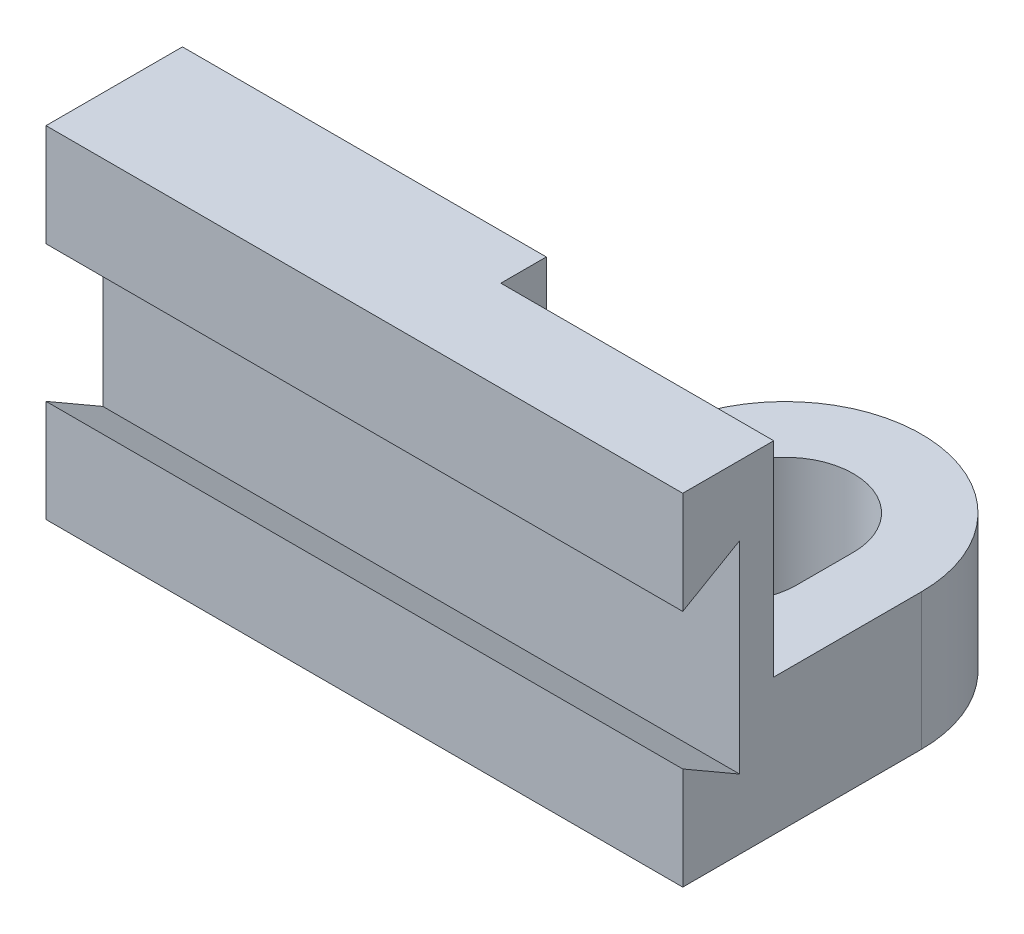
ISO-10303-21;
HEADER;
FILE_DESCRIPTION(('STEP AP214'),'2;1');
FILE_NAME('part.step','',(''),(''),'','','');
FILE_SCHEMA(('AUTOMOTIVE_DESIGN { 1 0 10303 214 1 1 1 1 }'));
ENDSEC;
DATA;
#1=APPLICATION_CONTEXT('core data for automotive mechanical design processes');
#2=APPLICATION_PROTOCOL_DEFINITION('international standard','automotive_design',2000,#1);
#3=PRODUCT_CONTEXT('',#1,'mechanical');
#4=PRODUCT('Part','Part','',(#3));
#5=PRODUCT_RELATED_PRODUCT_CATEGORY('part','',(#4));
#6=PRODUCT_DEFINITION_FORMATION('','',#4);
#7=PRODUCT_DEFINITION_CONTEXT('part definition',#1,'design');
#8=PRODUCT_DEFINITION('design','',#6,#7);
#9=PRODUCT_DEFINITION_SHAPE('','',#8);
#10=(LENGTH_UNIT() NAMED_UNIT(*) SI_UNIT(.MILLI.,.METRE.));
#11=(NAMED_UNIT(*) PLANE_ANGLE_UNIT() SI_UNIT($,.RADIAN.));
#12=(NAMED_UNIT(*) SI_UNIT($,.STERADIAN.) SOLID_ANGLE_UNIT());
#13=UNCERTAINTY_MEASURE_WITH_UNIT(LENGTH_MEASURE(1.E-05),#10,'distance_accuracy_value','');
#14=(GEOMETRIC_REPRESENTATION_CONTEXT(3) GLOBAL_UNCERTAINTY_ASSIGNED_CONTEXT((#13)) GLOBAL_UNIT_ASSIGNED_CONTEXT((#10,
#11,#12)) REPRESENTATION_CONTEXT('',''));
#15=CARTESIAN_POINT('',(0.,0.,0.));
#16=DIRECTION('',(0.,0.,1.));
#17=DIRECTION('',(1.,0.,0.));
#18=AXIS2_PLACEMENT_3D('',#15,#16,#17);
#19=CARTESIAN_POINT('',(0.,8.,0.));
#20=DIRECTION('',(0.,-1.,0.));
#21=DIRECTION('',(0.,0.,-1.));
#22=AXIS2_PLACEMENT_3D('',#19,#20,#21);
#23=PLANE('',#22);
#24=CARTESIAN_POINT('',(44.,8.,-21.));
#25=DIRECTION('',(0.,-1.,0.));
#26=DIRECTION('',(0.,0.,-1.));
#27=AXIS2_PLACEMENT_3D('',#24,#25,#26);
#28=CIRCLE('',#27,12.);
#29=CARTESIAN_POINT('',(40.466636051299,8.,-32.4680137428423));
#30=VERTEX_POINT('',#29);
#31=CARTESIAN_POINT('',(32.,8.,-21.));
#32=VERTEX_POINT('',#31);
#33=EDGE_CURVE('E12',#30,#32,#28,.F.);
#34=ORIENTED_EDGE('',*,*,#33,.F.);
#35=DIRECTION('',(0.955667811903527,0.,-0.29444699572508));
#36=VECTOR('',#35,1.);
#37=CARTESIAN_POINT('',(-5.62787032252309,8.,-18.2660193341695));
#38=LINE('',#37,#36);
#39=CARTESIAN_POINT('',(0.,8.,-20.));
#40=VERTEX_POINT('',#39);
#41=EDGE_CURVE('E226',#40,#30,#38,.T.);
#42=ORIENTED_EDGE('',*,*,#41,.F.);
#43=DIRECTION('',(0.,0.,-1.));
#44=VECTOR('',#43,1.);
#45=CARTESIAN_POINT('',(0.,8.,0.));
#46=LINE('',#45,#44);
#47=CARTESIAN_POINT('',(0.,8.,-12.));
#48=VERTEX_POINT('',#47);
#49=EDGE_CURVE('E223',#48,#40,#46,.T.);
#50=ORIENTED_EDGE('',*,*,#49,.F.);
#51=DIRECTION('',(1.,0.,0.));
#52=VECTOR('',#51,1.);
#53=CARTESIAN_POINT('',(0.,8.,-12.));
#54=LINE('',#53,#52);
#55=CARTESIAN_POINT('',(32.,8.,-12.));
#56=VERTEX_POINT('',#55);
#57=EDGE_CURVE('E230',#48,#56,#54,.T.);
#58=ORIENTED_EDGE('',*,*,#57,.T.);
#59=DIRECTION('',(0.,0.,1.));
#60=VECTOR('',#59,1.);
#61=CARTESIAN_POINT('',(32.,8.,-21.));
#62=LINE('',#61,#60);
#63=EDGE_CURVE('E203',#32,#56,#62,.T.);
#64=ORIENTED_EDGE('',*,*,#63,.F.);
#65=EDGE_LOOP('',(#34,#42,#50,#58,#64));
#66=FACE_BOUND('',#65,.T.);
#67=ADVANCED_FACE('F44',(#66),#23,.F.);
#68=CARTESIAN_POINT('',(32.,30.,-8.));
#69=DIRECTION('',(0.,0.,1.));
#70=DIRECTION('',(1.,0.,0.));
#71=AXIS2_PLACEMENT_3D('',#68,#69,#70);
#72=PLANE('',#71);
#73=DIRECTION('',(0.,-1.,0.));
#74=VECTOR('',#73,1.);
#75=CARTESIAN_POINT('',(56.,30.,-8.));
#76=LINE('',#75,#74);
#77=CARTESIAN_POINT('',(56.,30.,-8.));
#78=VERTEX_POINT('',#77);
#79=CARTESIAN_POINT('',(56.,12.,-8.));
#80=VERTEX_POINT('',#79);
#81=EDGE_CURVE('E313',#78,#80,#76,.T.);
#82=ORIENTED_EDGE('',*,*,#81,.T.);
#83=DIRECTION('',(1.,0.,0.));
#84=VECTOR('',#83,1.);
#85=CARTESIAN_POINT('',(32.,12.,-8.));
#86=LINE('',#85,#84);
#87=CARTESIAN_POINT('',(32.,12.,-8.));
#88=VERTEX_POINT('',#87);
#89=EDGE_CURVE('E59',#88,#80,#86,.T.);
#90=ORIENTED_EDGE('',*,*,#89,.F.);
#91=DIRECTION('',(0.,-1.,0.));
#92=VECTOR('',#91,1.);
#93=CARTESIAN_POINT('',(32.,30.,-8.));
#94=LINE('',#93,#92);
#95=CARTESIAN_POINT('',(32.,30.,-8.));
#96=VERTEX_POINT('',#95);
#97=EDGE_CURVE('E311',#96,#88,#94,.T.);
#98=ORIENTED_EDGE('',*,*,#97,.F.);
#99=DIRECTION('',(-1.,0.,0.));
#100=VECTOR('',#99,1.);
#101=CARTESIAN_POINT('',(32.,30.,-8.));
#102=LINE('',#101,#100);
#103=EDGE_CURVE('E294',#78,#96,#102,.T.);
#104=ORIENTED_EDGE('',*,*,#103,.F.);
#105=EDGE_LOOP('',(#82,#90,#98,#104));
#106=FACE_BOUND('',#105,.T.);
#107=ADVANCED_FACE('F358',(#106),#72,.F.);
#108=CARTESIAN_POINT('',(32.,30.,-12.));
#109=DIRECTION('',(-1.,0.,0.));
#110=DIRECTION('',(0.,0.,1.));
#111=AXIS2_PLACEMENT_3D('',#108,#109,#110);
#112=PLANE('',#111);
#113=ORIENTED_EDGE('',*,*,#97,.T.);
#114=DIRECTION('',(0.,0.,1.));
#115=VECTOR('',#114,1.);
#116=CARTESIAN_POINT('',(32.,12.,-21.));
#117=LINE('',#116,#115);
#118=CARTESIAN_POINT('',(32.,12.,-12.));
#119=VERTEX_POINT('',#118);
#120=EDGE_CURVE('E66',#119,#88,#117,.T.);
#121=ORIENTED_EDGE('',*,*,#120,.F.);
#122=DIRECTION('',(0.,-1.,0.));
#123=VECTOR('',#122,1.);
#124=CARTESIAN_POINT('',(32.,30.,-12.));
#125=LINE('',#124,#123);
#126=CARTESIAN_POINT('',(32.,30.,-12.));
#127=VERTEX_POINT('',#126);
#128=EDGE_CURVE('E309',#127,#119,#125,.T.);
#129=ORIENTED_EDGE('',*,*,#128,.F.);
#130=DIRECTION('',(0.,0.,-1.));
#131=VECTOR('',#130,1.);
#132=CARTESIAN_POINT('',(32.,30.,-12.));
#133=LINE('',#132,#131);
#134=EDGE_CURVE('E296',#96,#127,#133,.T.);
#135=ORIENTED_EDGE('',*,*,#134,.F.);
#136=EDGE_LOOP('',(#113,#121,#129,#135));
#137=FACE_BOUND('',#136,.T.);
#138=ADVANCED_FACE('F364',(#137),#112,.F.);
#139=CARTESIAN_POINT('',(0.,30.,-12.));
#140=DIRECTION('',(0.,0.,1.));
#141=DIRECTION('',(1.,0.,0.));
#142=AXIS2_PLACEMENT_3D('',#139,#140,#141);
#143=PLANE('',#142);
#144=ORIENTED_EDGE('',*,*,#57,.F.);
#145=DIRECTION('',(0.,-1.,0.));
#146=VECTOR('',#145,1.);
#147=CARTESIAN_POINT('',(0.,30.,-12.));
#148=LINE('',#147,#146);
#149=CARTESIAN_POINT('',(0.,30.,-12.));
#150=VERTEX_POINT('',#149);
#151=EDGE_CURVE('E300',#150,#48,#148,.T.);
#152=ORIENTED_EDGE('',*,*,#151,.F.);
#153=DIRECTION('',(-1.,0.,0.));
#154=VECTOR('',#153,1.);
#155=CARTESIAN_POINT('',(0.,30.,-12.));
#156=LINE('',#155,#154);
#157=EDGE_CURVE('E298',#127,#150,#156,.T.);
#158=ORIENTED_EDGE('',*,*,#157,.F.);
#159=ORIENTED_EDGE('',*,*,#128,.T.);
#160=DIRECTION('',(0.,1.,0.));
#161=VECTOR('',#160,1.);
#162=CARTESIAN_POINT('',(32.,30.,-12.));
#163=LINE('',#162,#161);
#164=EDGE_CURVE('E219',#56,#119,#163,.T.);
#165=ORIENTED_EDGE('',*,*,#164,.F.);
#166=EDGE_LOOP('',(#144,#152,#158,#159,#165));
#167=FACE_BOUND('',#166,.T.);
#168=ADVANCED_FACE('F353',(#167),#143,.F.);
#169=CARTESIAN_POINT('',(0.,30.,0.));
#170=DIRECTION('',(0.,0.,-1.));
#171=DIRECTION('',(-1.,0.,0.));
#172=AXIS2_PLACEMENT_3D('',#169,#170,#171);
#173=PLANE('',#172);
#174=DIRECTION('',(-1.,0.,0.));
#175=VECTOR('',#174,1.);
#176=CARTESIAN_POINT('',(56.,9.00074722567097,0.));
#177=LINE('',#176,#175);
#178=CARTESIAN_POINT('',(56.,9.00074722567097,0.));
#179=VERTEX_POINT('',#178);
#180=CARTESIAN_POINT('',(0.,9.00074722567097,0.));
#181=VERTEX_POINT('',#180);
#182=EDGE_CURVE('E273',#179,#181,#177,.T.);
#183=ORIENTED_EDGE('',*,*,#182,.T.);
#184=DIRECTION('',(0.,-1.,0.));
#185=VECTOR('',#184,1.);
#186=CARTESIAN_POINT('',(0.,30.,0.));
#187=LINE('',#186,#185);
#188=CARTESIAN_POINT('',(0.,0.,0.));
#189=VERTEX_POINT('',#188);
#190=EDGE_CURVE('E318',#181,#189,#187,.T.);
#191=ORIENTED_EDGE('',*,*,#190,.T.);
#192=DIRECTION('',(1.,0.,0.));
#193=VECTOR('',#192,1.);
#194=CARTESIAN_POINT('',(0.,0.,0.));
#195=LINE('',#194,#193);
#196=CARTESIAN_POINT('',(56.,0.,0.));
#197=VERTEX_POINT('',#196);
#198=EDGE_CURVE('E303',#189,#197,#195,.T.);
#199=ORIENTED_EDGE('',*,*,#198,.T.);
#200=DIRECTION('',(0.,-1.,0.));
#201=VECTOR('',#200,1.);
#202=CARTESIAN_POINT('',(56.,30.,0.));
#203=LINE('',#202,#201);
#204=EDGE_CURVE('E315',#179,#197,#203,.T.);
#205=ORIENTED_EDGE('',*,*,#204,.F.);
#206=EDGE_LOOP('',(#183,#191,#199,#205));
#207=FACE_BOUND('',#206,.T.);
#208=ADVANCED_FACE('F326',(#207),#173,.F.);
#209=CARTESIAN_POINT('',(0.,30.,-12.));
#210=DIRECTION('',(1.,0.,0.));
#211=DIRECTION('',(0.,0.,-1.));
#212=AXIS2_PLACEMENT_3D('',#209,#210,#211);
#213=PLANE('',#212);
#214=DIRECTION('',(0.,1.,0.));
#215=VECTOR('',#214,1.);
#216=CARTESIAN_POINT('',(0.,30.,-5.));
#217=LINE('',#216,#215);
#218=CARTESIAN_POINT('',(0.,6.11399587972281,-5.));
#219=VERTEX_POINT('',#218);
#220=CARTESIAN_POINT('',(0.,23.8867513459482,-5.));
#221=VERTEX_POINT('',#220);
#222=EDGE_CURVE('E282',#219,#221,#217,.T.);
#223=ORIENTED_EDGE('',*,*,#222,.T.);
#224=DIRECTION('',(0.,-0.500000000000004,0.866025403784436));
#225=VECTOR('',#224,1.);
#226=CARTESIAN_POINT('',(0.,28.4461524227067,-12.89711431703));
#227=LINE('',#226,#225);
#228=CARTESIAN_POINT('',(0.,21.,0.));
#229=VERTEX_POINT('',#228);
#230=EDGE_CURVE('E279',#221,#229,#227,.T.);
#231=ORIENTED_EDGE('',*,*,#230,.T.);
#232=CARTESIAN_POINT('',(0.,30.,0.));
#233=VERTEX_POINT('',#232);
#234=EDGE_CURVE('E52',#233,#229,#187,.T.);
#235=ORIENTED_EDGE('',*,*,#234,.F.);
#236=DIRECTION('',(0.,0.,1.));
#237=VECTOR('',#236,1.);
#238=CARTESIAN_POINT('',(0.,30.,-12.));
#239=LINE('',#238,#237);
#240=EDGE_CURVE('E286',#150,#233,#239,.T.);
#241=ORIENTED_EDGE('',*,*,#240,.F.);
#242=ORIENTED_EDGE('',*,*,#151,.T.);
#243=ORIENTED_EDGE('',*,*,#49,.T.);
#244=DIRECTION('',(0.,-1.,0.));
#245=VECTOR('',#244,1.);
#246=CARTESIAN_POINT('',(0.,8.,-20.));
#247=LINE('',#246,#245);
#248=CARTESIAN_POINT('',(0.,0.,-20.));
#249=VERTEX_POINT('',#248);
#250=EDGE_CURVE('E253',#40,#249,#247,.T.);
#251=ORIENTED_EDGE('',*,*,#250,.T.);
#252=DIRECTION('',(0.,0.,1.));
#253=VECTOR('',#252,1.);
#254=CARTESIAN_POINT('',(0.,0.,-12.));
#255=LINE('',#254,#253);
#256=EDGE_CURVE('E285',#249,#189,#255,.T.);
#257=ORIENTED_EDGE('',*,*,#256,.T.);
#258=ORIENTED_EDGE('',*,*,#190,.F.);
#259=DIRECTION('',(0.,0.500000000000005,0.866025403784436));
#260=VECTOR('',#259,1.);
#261=CARTESIAN_POINT('',(0.,9.05440799654666,0.0929431815300061));
#262=LINE('',#261,#260);
#263=EDGE_CURVE('E270',#219,#181,#262,.T.);
#264=ORIENTED_EDGE('',*,*,#263,.F.);
#265=EDGE_LOOP('',(#223,#231,#235,#241,#242,#243,#251,#257,#258,#264));
#266=FACE_BOUND('',#265,.T.);
#267=ADVANCED_FACE('F46',(#266),#213,.F.);
#268=ORIENTED_EDGE('',*,*,#234,.T.);
#269=DIRECTION('',(-1.,0.,0.));
#270=VECTOR('',#269,1.);
#271=CARTESIAN_POINT('',(56.,21.,0.));
#272=LINE('',#271,#270);
#273=CARTESIAN_POINT('',(56.,21.,0.));
#274=VERTEX_POINT('',#273);
#275=EDGE_CURVE('E271',#274,#229,#272,.T.);
#276=ORIENTED_EDGE('',*,*,#275,.F.);
#277=CARTESIAN_POINT('',(56.,30.,0.));
#278=VERTEX_POINT('',#277);
#279=EDGE_CURVE('E316',#278,#274,#203,.T.);
#280=ORIENTED_EDGE('',*,*,#279,.F.);
#281=DIRECTION('',(1.,0.,0.));
#282=VECTOR('',#281,1.);
#283=CARTESIAN_POINT('',(0.,30.,0.));
#284=LINE('',#283,#282);
#285=EDGE_CURVE('E289',#233,#278,#284,.T.);
#286=ORIENTED_EDGE('',*,*,#285,.F.);
#287=EDGE_LOOP('',(#268,#276,#280,#286));
#288=FACE_BOUND('',#287,.T.);
#289=ADVANCED_FACE('F407',(#288),#173,.F.);
#290=CARTESIAN_POINT('',(56.,30.,-8.));
#291=DIRECTION('',(-1.,0.,0.));
#292=DIRECTION('',(0.,0.,1.));
#293=AXIS2_PLACEMENT_3D('',#290,#291,#292);
#294=PLANE('',#293);
#295=ORIENTED_EDGE('',*,*,#279,.T.);
#296=DIRECTION('',(0.,0.500000000000004,-0.866025403784437));
#297=VECTOR('',#296,1.);
#298=CARTESIAN_POINT('',(56.,15.7499999999999,9.09326673973666));
#299=LINE('',#298,#297);
#300=CARTESIAN_POINT('',(56.,23.8867513459482,-4.99999999999999));
#301=VERTEX_POINT('',#300);
#302=EDGE_CURVE('E263',#274,#301,#299,.T.);
#303=ORIENTED_EDGE('',*,*,#302,.T.);
#304=DIRECTION('',(0.,-1.,0.));
#305=VECTOR('',#304,1.);
#306=CARTESIAN_POINT('',(56.,0.,-4.99999999999999));
#307=LINE('',#306,#305);
#308=CARTESIAN_POINT('',(56.,6.11399587972281,-4.99999999999999));
#309=VERTEX_POINT('',#308);
#310=EDGE_CURVE('E250',#301,#309,#307,.T.);
#311=ORIENTED_EDGE('',*,*,#310,.T.);
#312=DIRECTION('',(0.,-0.500000000000005,-0.866025403784436));
#313=VECTOR('',#312,1.);
#314=CARTESIAN_POINT('',(56.,6.75056041925319,-3.8974378752367));
#315=LINE('',#314,#313);
#316=EDGE_CURVE('E261',#179,#309,#315,.T.);
#317=ORIENTED_EDGE('',*,*,#316,.F.);
#318=ORIENTED_EDGE('',*,*,#204,.T.);
#319=DIRECTION('',(0.,0.,-1.));
#320=VECTOR('',#319,1.);
#321=CARTESIAN_POINT('',(56.,0.,-8.));
#322=LINE('',#321,#320);
#323=CARTESIAN_POINT('',(56.,0.,-21.));
#324=VERTEX_POINT('',#323);
#325=EDGE_CURVE('E290',#197,#324,#322,.T.);
#326=ORIENTED_EDGE('',*,*,#325,.T.);
#327=DIRECTION('',(0.,-1.,0.));
#328=VECTOR('',#327,1.);
#329=CARTESIAN_POINT('',(56.,8.,-21.));
#330=LINE('',#329,#328);
#331=CARTESIAN_POINT('',(56.,12.,-21.));
#332=VERTEX_POINT('',#331);
#333=EDGE_CURVE('E247',#332,#324,#330,.T.);
#334=ORIENTED_EDGE('',*,*,#333,.F.);
#335=DIRECTION('',(0.,0.,-1.));
#336=VECTOR('',#335,1.);
#337=CARTESIAN_POINT('',(56.,12.,-8.));
#338=LINE('',#337,#336);
#339=EDGE_CURVE('E211',#80,#332,#338,.T.);
#340=ORIENTED_EDGE('',*,*,#339,.F.);
#341=ORIENTED_EDGE('',*,*,#81,.F.);
#342=DIRECTION('',(0.,0.,-1.));
#343=VECTOR('',#342,1.);
#344=CARTESIAN_POINT('',(56.,30.,-8.));
#345=LINE('',#344,#343);
#346=EDGE_CURVE('E292',#278,#78,#345,.T.);
#347=ORIENTED_EDGE('',*,*,#346,.F.);
#348=EDGE_LOOP('',(#295,#303,#311,#317,#318,#326,#334,#340,#341,#347));
#349=FACE_BOUND('',#348,.T.);
#350=ADVANCED_FACE('F347',(#349),#294,.F.);
#351=CARTESIAN_POINT('',(0.,30.,0.));
#352=DIRECTION('',(0.,1.,0.));
#353=DIRECTION('',(0.,0.,1.));
#354=AXIS2_PLACEMENT_3D('',#351,#352,#353);
#355=PLANE('',#354);
#356=ORIENTED_EDGE('',*,*,#240,.T.);
#357=ORIENTED_EDGE('',*,*,#285,.T.);
#358=ORIENTED_EDGE('',*,*,#346,.T.);
#359=ORIENTED_EDGE('',*,*,#103,.T.);
#360=ORIENTED_EDGE('',*,*,#134,.T.);
#361=ORIENTED_EDGE('',*,*,#157,.T.);
#362=EDGE_LOOP('',(#356,#357,#358,#359,#360,#361));
#363=FACE_BOUND('',#362,.T.);
#364=ADVANCED_FACE('F397',(#363),#355,.T.);
#365=CARTESIAN_POINT('',(0.,0.,0.));
#366=DIRECTION('',(0.,1.,0.));
#367=DIRECTION('',(0.,0.,1.));
#368=AXIS2_PLACEMENT_3D('',#365,#366,#367);
#369=PLANE('',#368);
#370=ORIENTED_EDGE('',*,*,#256,.F.);
#371=DIRECTION('',(0.955667811903527,0.,-0.29444699572508));
#372=VECTOR('',#371,1.);
#373=CARTESIAN_POINT('',(-5.62787032252309,0.,-18.2660193341695));
#374=LINE('',#373,#372);
#375=CARTESIAN_POINT('',(40.466636051299,0.,-32.4680137428423));
#376=VERTEX_POINT('',#375);
#377=EDGE_CURVE('E242',#249,#376,#374,.T.);
#378=ORIENTED_EDGE('',*,*,#377,.T.);
#379=CARTESIAN_POINT('',(44.,0.,-21.));
#380=DIRECTION('',(0.,-1.,0.));
#381=DIRECTION('',(0.,0.,-1.));
#382=AXIS2_PLACEMENT_3D('',#379,#380,#381);
#383=CIRCLE('',#382,12.);
#384=EDGE_CURVE('E227',#324,#376,#383,.F.);
#385=ORIENTED_EDGE('',*,*,#384,.F.);
#386=ORIENTED_EDGE('',*,*,#325,.F.);
#387=ORIENTED_EDGE('',*,*,#198,.F.);
#388=EDGE_LOOP('',(#370,#378,#385,#386,#387));
#389=FACE_BOUND('',#388,.T.);
#390=CARTESIAN_POINT('',(44.,0.,-16.));
#391=DIRECTION('',(0.,-1.,0.));
#392=DIRECTION('',(0.,0.,-1.));
#393=AXIS2_PLACEMENT_3D('',#390,#391,#392);
#394=CIRCLE('',#393,6.);
#395=CARTESIAN_POINT('',(50.,0.,-16.));
#396=VERTEX_POINT('',#395);
#397=CARTESIAN_POINT('',(38.,0.,-16.));
#398=VERTEX_POINT('',#397);
#399=EDGE_CURVE('E222',#396,#398,#394,.T.);
#400=ORIENTED_EDGE('',*,*,#399,.F.);
#401=DIRECTION('',(0.,0.,-1.));
#402=VECTOR('',#401,1.);
#403=CARTESIAN_POINT('',(50.,0.,0.));
#404=LINE('',#403,#402);
#405=CARTESIAN_POINT('',(50.,0.,-21.));
#406=VERTEX_POINT('',#405);
#407=EDGE_CURVE('E236',#396,#406,#404,.T.);
#408=ORIENTED_EDGE('',*,*,#407,.T.);
#409=CARTESIAN_POINT('',(44.,0.,-21.));
#410=DIRECTION('',(0.,-1.,0.));
#411=DIRECTION('',(0.,0.,-1.));
#412=AXIS2_PLACEMENT_3D('',#409,#410,#411);
#413=CIRCLE('',#412,6.);
#414=CARTESIAN_POINT('',(38.,0.,-21.));
#415=VERTEX_POINT('',#414);
#416=EDGE_CURVE('E239',#415,#406,#413,.T.);
#417=ORIENTED_EDGE('',*,*,#416,.F.);
#418=DIRECTION('',(0.,0.,-1.));
#419=VECTOR('',#418,1.);
#420=CARTESIAN_POINT('',(38.,0.,0.));
#421=LINE('',#420,#419);
#422=EDGE_CURVE('E181',#398,#415,#421,.T.);
#423=ORIENTED_EDGE('',*,*,#422,.F.);
#424=EDGE_LOOP('',(#400,#408,#417,#423));
#425=FACE_BOUND('',#424,.T.);
#426=ADVANCED_FACE('F332',(#389,#425),#369,.F.);
#427=CARTESIAN_POINT('',(56.,0.,-4.99999999999999));
#428=DIRECTION('',(0.,0.,-1.));
#429=DIRECTION('',(-1.,0.,0.));
#430=AXIS2_PLACEMENT_3D('',#427,#428,#429);
#431=PLANE('',#430);
#432=DIRECTION('',(-1.,0.,0.));
#433=VECTOR('',#432,1.);
#434=CARTESIAN_POINT('',(56.,6.11399587972281,-4.99999999999999));
#435=LINE('',#434,#433);
#436=EDGE_CURVE('E266',#309,#219,#435,.T.);
#437=ORIENTED_EDGE('',*,*,#436,.F.);
#438=ORIENTED_EDGE('',*,*,#310,.F.);
#439=DIRECTION('',(-1.,0.,0.));
#440=VECTOR('',#439,1.);
#441=CARTESIAN_POINT('',(56.,23.8867513459482,-4.99999999999999));
#442=LINE('',#441,#440);
#443=EDGE_CURVE('E267',#301,#221,#442,.T.);
#444=ORIENTED_EDGE('',*,*,#443,.T.);
#445=ORIENTED_EDGE('',*,*,#222,.F.);
#446=EDGE_LOOP('',(#437,#438,#444,#445));
#447=FACE_BOUND('',#446,.T.);
#448=ADVANCED_FACE('F389',(#447),#431,.F.);
#449=CARTESIAN_POINT('',(56.,15.7499999999999,9.09326673973666));
#450=DIRECTION('',(0.,0.866025403784436,0.500000000000004));
#451=DIRECTION('',(0.,-0.500000000000004,0.866025403784436));
#452=AXIS2_PLACEMENT_3D('',#449,#450,#451);
#453=PLANE('',#452);
#454=ORIENTED_EDGE('',*,*,#443,.F.);
#455=ORIENTED_EDGE('',*,*,#302,.F.);
#456=ORIENTED_EDGE('',*,*,#275,.T.);
#457=ORIENTED_EDGE('',*,*,#230,.F.);
#458=EDGE_LOOP('',(#454,#455,#456,#457));
#459=FACE_BOUND('',#458,.T.);
#460=ADVANCED_FACE('F386',(#459),#453,.F.);
#461=CARTESIAN_POINT('',(56.,6.75056041925319,-3.8974378752367));
#462=DIRECTION('',(0.,0.866025403784436,-0.500000000000005));
#463=DIRECTION('',(0.,0.500000000000005,0.866025403784436));
#464=AXIS2_PLACEMENT_3D('',#461,#462,#463);
#465=PLANE('',#464);
#466=ORIENTED_EDGE('',*,*,#263,.T.);
#467=ORIENTED_EDGE('',*,*,#182,.F.);
#468=ORIENTED_EDGE('',*,*,#316,.T.);
#469=ORIENTED_EDGE('',*,*,#436,.T.);
#470=EDGE_LOOP('',(#466,#467,#468,#469));
#471=FACE_BOUND('',#470,.T.);
#472=ADVANCED_FACE('F372',(#471),#465,.T.);
#473=CARTESIAN_POINT('',(44.,8.,-21.));
#474=DIRECTION('',(0.,-1.,0.));
#475=DIRECTION('',(0.,0.,-1.));
#476=AXIS2_PLACEMENT_3D('',#473,#474,#475);
#477=CYLINDRICAL_SURFACE('',#476,12.);
#478=ORIENTED_EDGE('',*,*,#384,.T.);
#479=DIRECTION('',(0.,-1.,0.));
#480=VECTOR('',#479,1.);
#481=CARTESIAN_POINT('',(40.466636051299,8.,-32.4680137428423));
#482=LINE('',#481,#480);
#483=EDGE_CURVE('E251',#30,#376,#482,.T.);
#484=ORIENTED_EDGE('',*,*,#483,.F.);
#485=ORIENTED_EDGE('',*,*,#33,.T.);
#486=DIRECTION('',(0.,-1.,0.));
#487=VECTOR('',#486,1.);
#488=CARTESIAN_POINT('',(32.,12.,-21.));
#489=LINE('',#488,#487);
#490=CARTESIAN_POINT('',(32.,12.,-21.));
#491=VERTEX_POINT('',#490);
#492=EDGE_CURVE('E214',#491,#32,#489,.T.);
#493=ORIENTED_EDGE('',*,*,#492,.F.);
#494=CARTESIAN_POINT('',(44.,12.,-21.));
#495=DIRECTION('',(0.,1.,0.));
#496=DIRECTION('',(0.,0.,1.));
#497=AXIS2_PLACEMENT_3D('',#494,#495,#496);
#498=CIRCLE('',#497,12.);
#499=EDGE_CURVE('E204',#332,#491,#498,.T.);
#500=ORIENTED_EDGE('',*,*,#499,.F.);
#501=ORIENTED_EDGE('',*,*,#333,.T.);
#502=EDGE_LOOP('',(#478,#484,#485,#493,#500,#501));
#503=FACE_BOUND('',#502,.T.);
#504=ADVANCED_FACE('F343',(#503),#477,.T.);
#505=CARTESIAN_POINT('',(44.,8.,-16.));
#506=DIRECTION('',(0.,-1.,0.));
#507=DIRECTION('',(0.,0.,-1.));
#508=AXIS2_PLACEMENT_3D('',#505,#506,#507);
#509=CYLINDRICAL_SURFACE('',#508,6.);
#510=ORIENTED_EDGE('',*,*,#399,.T.);
#511=DIRECTION('',(0.,-1.,0.));
#512=VECTOR('',#511,1.);
#513=CARTESIAN_POINT('',(38.,8.,-16.));
#514=LINE('',#513,#512);
#515=CARTESIAN_POINT('',(38.,12.,-16.));
#516=VERTEX_POINT('',#515);
#517=EDGE_CURVE('E185',#516,#398,#514,.T.);
#518=ORIENTED_EDGE('',*,*,#517,.F.);
#519=CARTESIAN_POINT('',(44.,12.,-15.9999999999671));
#520=DIRECTION('',(0.,1.,0.));
#521=DIRECTION('',(0.,0.,1.));
#522=AXIS2_PLACEMENT_3D('',#519,#520,#521);
#523=CIRCLE('',#522,5.99999999999999);
#524=CARTESIAN_POINT('',(50.,12.,-15.9999999999671));
#525=VERTEX_POINT('',#524);
#526=EDGE_CURVE('E197',#516,#525,#523,.T.);
#527=ORIENTED_EDGE('',*,*,#526,.T.);
#528=DIRECTION('',(0.,-1.,0.));
#529=VECTOR('',#528,1.);
#530=CARTESIAN_POINT('',(50.,8.,-16.));
#531=LINE('',#530,#529);
#532=EDGE_CURVE('E233',#525,#396,#531,.T.);
#533=ORIENTED_EDGE('',*,*,#532,.T.);
#534=EDGE_LOOP('',(#510,#518,#527,#533));
#535=FACE_BOUND('',#534,.T.);
#536=ADVANCED_FACE('F371',(#535),#509,.F.);
#537=CARTESIAN_POINT('',(38.,8.,0.));
#538=DIRECTION('',(-1.,0.,0.));
#539=DIRECTION('',(0.,0.,1.));
#540=AXIS2_PLACEMENT_3D('',#537,#538,#539);
#541=PLANE('',#540);
#542=ORIENTED_EDGE('',*,*,#422,.T.);
#543=DIRECTION('',(0.,-1.,0.));
#544=VECTOR('',#543,1.);
#545=CARTESIAN_POINT('',(38.,8.,-21.));
#546=LINE('',#545,#544);
#547=CARTESIAN_POINT('',(38.,12.,-21.));
#548=VERTEX_POINT('',#547);
#549=EDGE_CURVE('E174',#548,#415,#546,.T.);
#550=ORIENTED_EDGE('',*,*,#549,.F.);
#551=DIRECTION('',(0.,0.,1.));
#552=VECTOR('',#551,1.);
#553=CARTESIAN_POINT('',(38.,12.,-21.));
#554=LINE('',#553,#552);
#555=EDGE_CURVE('E179',#548,#516,#554,.T.);
#556=ORIENTED_EDGE('',*,*,#555,.T.);
#557=ORIENTED_EDGE('',*,*,#517,.T.);
#558=EDGE_LOOP('',(#542,#550,#556,#557));
#559=FACE_BOUND('',#558,.T.);
#560=ADVANCED_FACE('F176',(#559),#541,.F.);
#561=CARTESIAN_POINT('',(44.,8.,-21.));
#562=DIRECTION('',(0.,-1.,0.));
#563=DIRECTION('',(0.,0.,-1.));
#564=AXIS2_PLACEMENT_3D('',#561,#562,#563);
#565=CYLINDRICAL_SURFACE('',#564,6.);
#566=ORIENTED_EDGE('',*,*,#416,.T.);
#567=DIRECTION('',(0.,-1.,0.));
#568=VECTOR('',#567,1.);
#569=CARTESIAN_POINT('',(50.,8.,-21.));
#570=LINE('',#569,#568);
#571=CARTESIAN_POINT('',(50.,12.,-21.));
#572=VERTEX_POINT('',#571);
#573=EDGE_CURVE('E186',#572,#406,#570,.T.);
#574=ORIENTED_EDGE('',*,*,#573,.F.);
#575=CARTESIAN_POINT('',(44.,12.,-21.));
#576=DIRECTION('',(0.,1.,0.));
#577=DIRECTION('',(0.,0.,-1.));
#578=AXIS2_PLACEMENT_3D('',#575,#576,#577);
#579=CIRCLE('',#578,6.);
#580=EDGE_CURVE('E189',#572,#548,#579,.T.);
#581=ORIENTED_EDGE('',*,*,#580,.T.);
#582=ORIENTED_EDGE('',*,*,#549,.T.);
#583=EDGE_LOOP('',(#566,#574,#581,#582));
#584=FACE_BOUND('',#583,.T.);
#585=ADVANCED_FACE('F190',(#584),#565,.F.);
#586=CARTESIAN_POINT('',(50.,8.,0.));
#587=DIRECTION('',(-1.,0.,0.));
#588=DIRECTION('',(0.,0.,1.));
#589=AXIS2_PLACEMENT_3D('',#586,#587,#588);
#590=PLANE('',#589);
#591=ORIENTED_EDGE('',*,*,#407,.F.);
#592=ORIENTED_EDGE('',*,*,#532,.F.);
#593=DIRECTION('',(0.,0.,-1.));
#594=VECTOR('',#593,1.);
#595=CARTESIAN_POINT('',(50.,12.,-21.));
#596=LINE('',#595,#594);
#597=EDGE_CURVE('E199',#525,#572,#596,.T.);
#598=ORIENTED_EDGE('',*,*,#597,.T.);
#599=ORIENTED_EDGE('',*,*,#573,.T.);
#600=EDGE_LOOP('',(#591,#592,#598,#599));
#601=FACE_BOUND('',#600,.T.);
#602=ADVANCED_FACE('F375',(#601),#590,.T.);
#603=CARTESIAN_POINT('',(-5.62787032252309,8.,-18.2660193341695));
#604=DIRECTION('',(-0.29444699572508,0.,-0.955667811903527));
#605=DIRECTION('',(-0.955667811903527,0.,0.29444699572508));
#606=AXIS2_PLACEMENT_3D('',#603,#604,#605);
#607=PLANE('',#606);
#608=ORIENTED_EDGE('',*,*,#377,.F.);
#609=ORIENTED_EDGE('',*,*,#250,.F.);
#610=ORIENTED_EDGE('',*,*,#41,.T.);
#611=ORIENTED_EDGE('',*,*,#483,.T.);
#612=EDGE_LOOP('',(#608,#609,#610,#611));
#613=FACE_BOUND('',#612,.T.);
#614=ADVANCED_FACE('F339',(#613),#607,.T.);
#615=CARTESIAN_POINT('',(32.,12.,-21.));
#616=DIRECTION('',(1.,0.,0.));
#617=DIRECTION('',(0.,0.,-1.));
#618=AXIS2_PLACEMENT_3D('',#615,#616,#617);
#619=PLANE('',#618);
#620=ORIENTED_EDGE('',*,*,#63,.T.);
#621=ORIENTED_EDGE('',*,*,#164,.T.);
#622=EDGE_CURVE('E207',#491,#119,#117,.T.);
#623=ORIENTED_EDGE('',*,*,#622,.F.);
#624=ORIENTED_EDGE('',*,*,#492,.T.);
#625=EDGE_LOOP('',(#620,#621,#623,#624));
#626=FACE_BOUND('',#625,.T.);
#627=ADVANCED_FACE('F351',(#626),#619,.F.);
#628=CARTESIAN_POINT('',(44.,12.,-21.));
#629=DIRECTION('',(0.,1.,0.));
#630=DIRECTION('',(0.,0.,1.));
#631=AXIS2_PLACEMENT_3D('',#628,#629,#630);
#632=PLANE('',#631);
#633=ORIENTED_EDGE('',*,*,#499,.T.);
#634=ORIENTED_EDGE('',*,*,#622,.T.);
#635=ORIENTED_EDGE('',*,*,#120,.T.);
#636=ORIENTED_EDGE('',*,*,#89,.T.);
#637=ORIENTED_EDGE('',*,*,#339,.T.);
#638=EDGE_LOOP('',(#633,#634,#635,#636,#637));
#639=FACE_BOUND('',#638,.T.);
#640=ORIENTED_EDGE('',*,*,#555,.F.);
#641=ORIENTED_EDGE('',*,*,#580,.F.);
#642=ORIENTED_EDGE('',*,*,#597,.F.);
#643=ORIENTED_EDGE('',*,*,#526,.F.);
#644=EDGE_LOOP('',(#640,#641,#642,#643));
#645=FACE_BOUND('',#644,.T.);
#646=ADVANCED_FACE('F195',(#639,#645),#632,.T.);
#647=CLOSED_SHELL('',(#67,#107,#138,#168,#208,#267,#289,#350,#364,#426,#448,#460,#472,#504,#536,
#560,#585,#602,#614,#627,#646));
#648=MANIFOLD_SOLID_BREP('B2',#647);
#649=ADVANCED_BREP_SHAPE_REPRESENTATION('',(#18,#648),#14);
#650=SHAPE_DEFINITION_REPRESENTATION(#9,#649);
ENDSEC;
END-ISO-10303-21;
